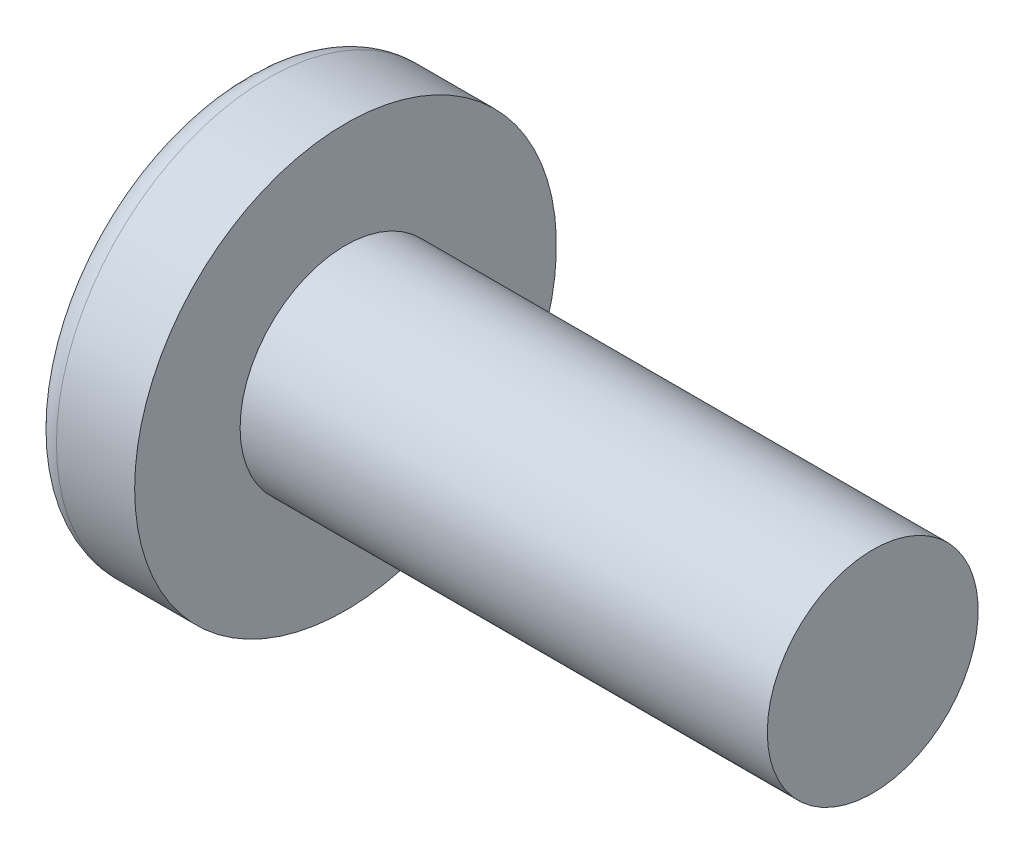
ISO-10303-21;
HEADER;
FILE_DESCRIPTION(('STEP AP214'),'2;1');
FILE_NAME('part.step','',(''),(''),'','','');
FILE_SCHEMA(('AUTOMOTIVE_DESIGN { 1 0 10303 214 1 1 1 1 }'));
ENDSEC;
DATA;
#1=APPLICATION_CONTEXT('core data for automotive mechanical design processes');
#2=APPLICATION_PROTOCOL_DEFINITION('international standard','automotive_design',2000,#1);
#3=PRODUCT_CONTEXT('',#1,'mechanical');
#4=PRODUCT('Part','Part','',(#3));
#5=PRODUCT_RELATED_PRODUCT_CATEGORY('part','',(#4));
#6=PRODUCT_DEFINITION_FORMATION('','',#4);
#7=PRODUCT_DEFINITION_CONTEXT('part definition',#1,'design');
#8=PRODUCT_DEFINITION('design','',#6,#7);
#9=PRODUCT_DEFINITION_SHAPE('','',#8);
#10=(LENGTH_UNIT() NAMED_UNIT(*) SI_UNIT(.MILLI.,.METRE.));
#11=(NAMED_UNIT(*) PLANE_ANGLE_UNIT() SI_UNIT($,.RADIAN.));
#12=(NAMED_UNIT(*) SI_UNIT($,.STERADIAN.) SOLID_ANGLE_UNIT());
#13=UNCERTAINTY_MEASURE_WITH_UNIT(LENGTH_MEASURE(1.E-05),#10,'distance_accuracy_value','');
#14=(GEOMETRIC_REPRESENTATION_CONTEXT(3) GLOBAL_UNCERTAINTY_ASSIGNED_CONTEXT((#13)) GLOBAL_UNIT_ASSIGNED_CONTEXT((#10,
#11,#12)) REPRESENTATION_CONTEXT('',''));
#15=CARTESIAN_POINT('',(0.,0.,0.));
#16=DIRECTION('',(0.,0.,1.));
#17=DIRECTION('',(1.,0.,0.));
#18=AXIS2_PLACEMENT_3D('',#15,#16,#17);
#19=CARTESIAN_POINT('',(6.5,0.,0.));
#20=DIRECTION('',(-1.,0.,0.));
#21=DIRECTION('',(0.,1.,0.));
#22=AXIS2_PLACEMENT_3D('',#19,#20,#21);
#23=SPHERICAL_SURFACE('',#22,6.5);
#24=CARTESIAN_POINT('',(1.22696010591455,0.,0.));
#25=DIRECTION('',(-1.,0.,0.));
#26=DIRECTION('',(0.,0.,1.));
#27=AXIS2_PLACEMENT_3D('',#24,#25,#26);
#28=CIRCLE('',#27,3.80066445182724);
#29=CARTESIAN_POINT('',(1.22696010591455,0.,3.80066445182724));
#30=VERTEX_POINT('',#29);
#31=EDGE_CURVE('E158',#30,#30,#28,.T.);
#32=ORIENTED_EDGE('',*,*,#31,.T.);
#33=EDGE_LOOP('',(#32));
#34=FACE_BOUND('',#33,.T.);
#35=CARTESIAN_POINT('',(6.48571960757402,-0.15048155459631,0.));
#36=DIRECTION('',(-0.0944735162161081,-0.995527375180494,0.));
#37=DIRECTION('',(0.995527375180495,-0.0944735162161082,0.));
#38=AXIS2_PLACEMENT_3D('',#35,#36,#37);
#39=CIRCLE('',#38,6.49824217555166);
#40=CARTESIAN_POINT('',(0.314004666074214,0.4352015980154,1.94783502836694));
#41=VERTEX_POINT('',#40);
#42=CARTESIAN_POINT('',(0.0329034112486453,0.461877533422321,0.461877533422322));
#43=VERTEX_POINT('',#42);
#44=EDGE_CURVE('E133',#41,#43,#39,.T.);
#45=ORIENTED_EDGE('',*,*,#44,.F.);
#46=CARTESIAN_POINT('',(5.02565375064329,0.,-1.83590765485334));
#47=DIRECTION('',(0.626149356629993,0.,0.779703137861998));
#48=DIRECTION('',(0.779703137861998,0.,-0.626149356629993));
#49=AXIS2_PLACEMENT_3D('',#46,#47,#48);
#50=CIRCLE('',#49,6.05852673674539);
#51=CARTESIAN_POINT('',(0.314004666074213,-0.435201598015413,1.94783502836693));
#52=VERTEX_POINT('',#51);
#53=EDGE_CURVE('E126',#41,#52,#50,.T.);
#54=ORIENTED_EDGE('',*,*,#53,.T.);
#55=CARTESIAN_POINT('',(6.48571960757402,0.150481554596309,0.));
#56=DIRECTION('',(-0.0944735162161078,0.995527375180494,0.));
#57=DIRECTION('',(-0.995527375180495,-0.0944735162161079,0.));
#58=AXIS2_PLACEMENT_3D('',#55,#56,#57);
#59=CIRCLE('',#58,6.49824217555166);
#60=CARTESIAN_POINT('',(0.0329034112486444,-0.461877533422324,0.461877533422322));
#61=VERTEX_POINT('',#60);
#62=EDGE_CURVE('E199',#61,#52,#59,.T.);
#63=ORIENTED_EDGE('',*,*,#62,.F.);
#64=CARTESIAN_POINT('',(6.48571960757402,0.,-0.150481554596309));
#65=DIRECTION('',(-0.0944735162161078,0.,-0.995527375180494));
#66=DIRECTION('',(-0.995527375180495,0.,0.0944735162161079));
#67=AXIS2_PLACEMENT_3D('',#64,#65,#66);
#68=CIRCLE('',#67,6.49824217555166);
#69=CARTESIAN_POINT('',(0.314004666074211,-1.94783502836694,0.435201598015406));
#70=VERTEX_POINT('',#69);
#71=EDGE_CURVE('E174',#70,#61,#68,.T.);
#72=ORIENTED_EDGE('',*,*,#71,.F.);
#73=CARTESIAN_POINT('',(5.02565375064329,1.83590765485333,0.));
#74=DIRECTION('',(0.626149356629993,-0.779703137861998,0.));
#75=DIRECTION('',(0.779703137861998,0.626149356629993,0.));
#76=AXIS2_PLACEMENT_3D('',#73,#74,#75);
#77=CIRCLE('',#76,6.05852673674539);
#78=CARTESIAN_POINT('',(0.314004666074211,-1.94783502836694,-0.435201598015407));
#79=VERTEX_POINT('',#78);
#80=EDGE_CURVE('E170',#70,#79,#77,.T.);
#81=ORIENTED_EDGE('',*,*,#80,.T.);
#82=CARTESIAN_POINT('',(6.48571960757402,0.,0.15048155459631));
#83=DIRECTION('',(-0.0944735162161081,0.,0.995527375180494));
#84=DIRECTION('',(0.995527375180495,0.,0.0944735162161082));
#85=AXIS2_PLACEMENT_3D('',#82,#83,#84);
#86=CIRCLE('',#85,6.49824217555166);
#87=CARTESIAN_POINT('',(0.0329034112486453,-0.46187753342232,-0.461877533422323));
#88=VERTEX_POINT('',#87);
#89=EDGE_CURVE('E54',#88,#79,#86,.T.);
#90=ORIENTED_EDGE('',*,*,#89,.F.);
#91=CARTESIAN_POINT('',(0.314004666074212,-0.435201598015399,-1.94783502836694));
#92=VERTEX_POINT('',#91);
#93=EDGE_CURVE('E196',#92,#88,#59,.T.);
#94=ORIENTED_EDGE('',*,*,#93,.F.);
#95=CARTESIAN_POINT('',(5.02565375064329,0.,1.83590765485334));
#96=DIRECTION('',(0.626149356629993,0.,-0.779703137861998));
#97=DIRECTION('',(-0.779703137861998,0.,-0.626149356629993));
#98=AXIS2_PLACEMENT_3D('',#95,#96,#97);
#99=CIRCLE('',#98,6.05852673674539);
#100=CARTESIAN_POINT('',(0.314004666074213,0.435201598015413,-1.94783502836693));
#101=VERTEX_POINT('',#100);
#102=EDGE_CURVE('E189',#92,#101,#99,.T.);
#103=ORIENTED_EDGE('',*,*,#102,.T.);
#104=CARTESIAN_POINT('',(0.0329034112486453,0.461877533422324,-0.461877533422323));
#105=VERTEX_POINT('',#104);
#106=EDGE_CURVE('E111',#105,#101,#39,.T.);
#107=ORIENTED_EDGE('',*,*,#106,.F.);
#108=CARTESIAN_POINT('',(0.314004666074214,1.94783502836693,-0.435201598015406));
#109=VERTEX_POINT('',#108);
#110=EDGE_CURVE('E47',#109,#105,#86,.T.);
#111=ORIENTED_EDGE('',*,*,#110,.F.);
#112=CARTESIAN_POINT('',(5.02565375064329,-1.83590765485334,0.));
#113=DIRECTION('',(0.626149356629993,0.779703137861998,0.));
#114=DIRECTION('',(-0.779703137861998,0.626149356629993,0.));
#115=AXIS2_PLACEMENT_3D('',#112,#113,#114);
#116=CIRCLE('',#115,6.05852673674539);
#117=CARTESIAN_POINT('',(0.314004666074214,1.94783502836693,0.435201598015406));
#118=VERTEX_POINT('',#117);
#119=EDGE_CURVE('E11',#109,#118,#116,.T.);
#120=ORIENTED_EDGE('',*,*,#119,.T.);
#121=EDGE_CURVE('E173',#43,#118,#68,.T.);
#122=ORIENTED_EDGE('',*,*,#121,.F.);
#123=EDGE_LOOP('',(#45,#54,#63,#72,#81,#90,#94,#103,#107,#111,#120,#122));
#124=FACE_BOUND('',#123,.T.);
#125=ADVANCED_FACE('F39',(#34,#124),#23,.T.);
#126=CARTESIAN_POINT('',(2.73951715374841,0.,-0.20502541296061));
#127=DIRECTION('',(-0.0944735162161081,0.,0.995527375180494));
#128=DIRECTION('',(0.995527375180495,0.,0.0944735162161082));
#129=AXIS2_PLACEMENT_3D('',#126,#127,#128);
#130=PLANE('',#129);
#131=ORIENTED_EDGE('',*,*,#110,.T.);
#132=DIRECTION('',(0.991114231601325,-0.0940547178968607,0.0940547178968604));
#133=VECTOR('',#132,1.);
#134=CARTESIAN_POINT('',(2.75862941145706,0.203211698708667,-0.203211698708667));
#135=LINE('',#134,#133);
#136=CARTESIAN_POINT('',(2.45,0.232500000000001,-0.232499999999999));
#137=VERTEX_POINT('',#136);
#138=EDGE_CURVE('E109',#105,#137,#135,.T.);
#139=ORIENTED_EDGE('',*,*,#138,.T.);
#140=DIRECTION('',(0.777577482844895,-0.624442325509115,0.0737905162291584));
#141=VECTOR('',#140,1.);
#142=CARTESIAN_POINT('',(0.,2.2,-0.465));
#143=LINE('',#142,#141);
#144=EDGE_CURVE('E131',#109,#137,#143,.T.);
#145=ORIENTED_EDGE('',*,*,#144,.F.);
#146=EDGE_LOOP('',(#131,#139,#145));
#147=FACE_BOUND('',#146,.T.);
#148=ADVANCED_FACE('F130',(#147),#130,.T.);
#149=DIRECTION('',(0.777577482844895,0.624442325509115,0.0737905162291584));
#150=VECTOR('',#149,1.);
#151=CARTESIAN_POINT('',(0.,-2.2,-0.465));
#152=LINE('',#151,#150);
#153=CARTESIAN_POINT('',(2.45,-0.2325,-0.2325));
#154=VERTEX_POINT('',#153);
#155=EDGE_CURVE('E152',#79,#154,#152,.T.);
#156=ORIENTED_EDGE('',*,*,#155,.T.);
#157=DIRECTION('',(-0.991114231601325,-0.0940547178968598,-0.0940547178968604));
#158=VECTOR('',#157,1.);
#159=CARTESIAN_POINT('',(2.75862941145706,-0.203211698708666,-0.203211698708667));
#160=LINE('',#159,#158);
#161=EDGE_CURVE('E197',#154,#88,#160,.T.);
#162=ORIENTED_EDGE('',*,*,#161,.T.);
#163=ORIENTED_EDGE('',*,*,#89,.T.);
#164=EDGE_LOOP('',(#156,#162,#163));
#165=FACE_BOUND('',#164,.T.);
#166=ADVANCED_FACE('F230',(#165),#130,.T.);
#167=CARTESIAN_POINT('',(2.73951715374841,0.,0.20502541296061));
#168=DIRECTION('',(-0.0944735162161078,0.,-0.995527375180494));
#169=DIRECTION('',(-0.995527375180495,0.,0.0944735162161079));
#170=AXIS2_PLACEMENT_3D('',#167,#168,#169);
#171=PLANE('',#170);
#172=DIRECTION('',(0.777577482844895,-0.624442325509115,-0.0737905162291583));
#173=VECTOR('',#172,1.);
#174=CARTESIAN_POINT('',(0.,2.2,0.465));
#175=LINE('',#174,#173);
#176=CARTESIAN_POINT('',(2.45,0.2325,0.2325));
#177=VERTEX_POINT('',#176);
#178=EDGE_CURVE('E138',#118,#177,#175,.T.);
#179=ORIENTED_EDGE('',*,*,#178,.T.);
#180=DIRECTION('',(-0.991114231601325,0.0940547178968601,0.0940547178968601));
#181=VECTOR('',#180,1.);
#182=CARTESIAN_POINT('',(2.75862941145706,0.203211698708666,0.203211698708667));
#183=LINE('',#182,#181);
#184=EDGE_CURVE('E185',#177,#43,#183,.T.);
#185=ORIENTED_EDGE('',*,*,#184,.T.);
#186=ORIENTED_EDGE('',*,*,#121,.T.);
#187=EDGE_LOOP('',(#179,#185,#186));
#188=FACE_BOUND('',#187,.T.);
#189=ADVANCED_FACE('F183',(#188),#171,.T.);
#190=ORIENTED_EDGE('',*,*,#71,.T.);
#191=DIRECTION('',(0.991114231601325,0.0940547178968604,-0.0940547178968601));
#192=VECTOR('',#191,1.);
#193=CARTESIAN_POINT('',(2.75862941145706,-0.203211698708668,0.203211698708667));
#194=LINE('',#193,#192);
#195=CARTESIAN_POINT('',(2.45,-0.232500000000001,0.232499999999999));
#196=VERTEX_POINT('',#195);
#197=EDGE_CURVE('E202',#61,#196,#194,.T.);
#198=ORIENTED_EDGE('',*,*,#197,.T.);
#199=DIRECTION('',(0.777577482844895,0.624442325509115,-0.0737905162291581));
#200=VECTOR('',#199,1.);
#201=CARTESIAN_POINT('',(0.,-2.2,0.464999999999999));
#202=LINE('',#201,#200);
#203=EDGE_CURVE('E149',#70,#196,#202,.T.);
#204=ORIENTED_EDGE('',*,*,#203,.F.);
#205=EDGE_LOOP('',(#190,#198,#204));
#206=FACE_BOUND('',#205,.T.);
#207=ADVANCED_FACE('F249',(#206),#171,.T.);
#208=CARTESIAN_POINT('',(-25.4,0.,0.));
#209=DIRECTION('',(-1.,0.,0.));
#210=DIRECTION('',(0.,0.,1.));
#211=AXIS2_PLACEMENT_3D('',#208,#209,#210);
#212=CYLINDRICAL_SURFACE('',#211,2.);
#213=CARTESIAN_POINT('',(13.1,0.,0.));
#214=DIRECTION('',(-1.,0.,0.));
#215=DIRECTION('',(0.,0.,1.));
#216=AXIS2_PLACEMENT_3D('',#213,#214,#215);
#217=CIRCLE('',#216,2.);
#218=CARTESIAN_POINT('',(13.1,0.,2.));
#219=VERTEX_POINT('',#218);
#220=EDGE_CURVE('E137',#219,#219,#217,.T.);
#221=ORIENTED_EDGE('',*,*,#220,.T.);
#222=EDGE_LOOP('',(#221));
#223=FACE_BOUND('',#222,.T.);
#224=CARTESIAN_POINT('',(3.1,0.,0.));
#225=DIRECTION('',(-1.,0.,0.));
#226=DIRECTION('',(0.,0.,1.));
#227=AXIS2_PLACEMENT_3D('',#224,#225,#226);
#228=CIRCLE('',#227,2.);
#229=CARTESIAN_POINT('',(3.1,0.,2.));
#230=VERTEX_POINT('',#229);
#231=EDGE_CURVE('E167',#230,#230,#228,.T.);
#232=ORIENTED_EDGE('',*,*,#231,.F.);
#233=EDGE_LOOP('',(#232));
#234=FACE_BOUND('',#233,.T.);
#235=ADVANCED_FACE('F41',(#223,#234),#212,.T.);
#236=CARTESIAN_POINT('',(3.1,2.,0.));
#237=DIRECTION('',(-1.,0.,0.));
#238=DIRECTION('',(0.,0.,1.));
#239=AXIS2_PLACEMENT_3D('',#236,#237,#238);
#240=PLANE('',#239);
#241=CARTESIAN_POINT('',(3.1,0.,0.));
#242=DIRECTION('',(-1.,0.,0.));
#243=DIRECTION('',(0.,0.,1.));
#244=AXIS2_PLACEMENT_3D('',#241,#242,#243);
#245=CIRCLE('',#244,4.);
#246=CARTESIAN_POINT('',(3.1,0.,4.));
#247=VERTEX_POINT('',#246);
#248=EDGE_CURVE('E164',#247,#247,#245,.T.);
#249=ORIENTED_EDGE('',*,*,#248,.F.);
#250=EDGE_LOOP('',(#249));
#251=FACE_BOUND('',#250,.T.);
#252=ORIENTED_EDGE('',*,*,#231,.T.);
#253=EDGE_LOOP('',(#252));
#254=FACE_BOUND('',#253,.T.);
#255=ADVANCED_FACE('F242',(#251,#254),#240,.F.);
#256=CARTESIAN_POINT('',(-25.4,0.,0.));
#257=DIRECTION('',(-1.,0.,0.));
#258=DIRECTION('',(0.,0.,1.));
#259=AXIS2_PLACEMENT_3D('',#256,#257,#258);
#260=CYLINDRICAL_SURFACE('',#259,4.);
#261=ORIENTED_EDGE('',*,*,#248,.T.);
#262=EDGE_LOOP('',(#261));
#263=FACE_BOUND('',#262,.T.);
#264=CARTESIAN_POINT('',(1.61635382117009,0.,0.));
#265=DIRECTION('',(-1.,0.,0.));
#266=DIRECTION('',(0.,0.,1.));
#267=AXIS2_PLACEMENT_3D('',#264,#265,#266);
#268=CIRCLE('',#267,4.);
#269=CARTESIAN_POINT('',(1.61635382117009,0.,4.));
#270=VERTEX_POINT('',#269);
#271=EDGE_CURVE('E161',#270,#270,#268,.T.);
#272=ORIENTED_EDGE('',*,*,#271,.F.);
#273=EDGE_LOOP('',(#272));
#274=FACE_BOUND('',#273,.T.);
#275=ADVANCED_FACE('F239',(#263,#274),#260,.T.);
#276=CARTESIAN_POINT('',(1.61635382117009,0.,0.));
#277=DIRECTION('',(-1.,0.,0.));
#278=DIRECTION('',(0.,0.,1.));
#279=AXIS2_PLACEMENT_3D('',#276,#277,#278);
#280=TOROIDAL_SURFACE('',#279,3.52,0.479999999999999);
#281=ORIENTED_EDGE('',*,*,#271,.T.);
#282=EDGE_LOOP('',(#281));
#283=FACE_BOUND('',#282,.T.);
#284=ORIENTED_EDGE('',*,*,#31,.F.);
#285=EDGE_LOOP('',(#284));
#286=FACE_BOUND('',#285,.T.);
#287=ADVANCED_FACE('F236',(#283,#286),#280,.T.);
#288=CARTESIAN_POINT('',(13.1,2.,0.));
#289=DIRECTION('',(1.,0.,0.));
#290=DIRECTION('',(0.,0.,-1.));
#291=AXIS2_PLACEMENT_3D('',#288,#289,#290);
#292=PLANE('',#291);
#293=ORIENTED_EDGE('',*,*,#220,.F.);
#294=EDGE_LOOP('',(#293));
#295=FACE_BOUND('',#294,.T.);
#296=ADVANCED_FACE('F234',(#295),#292,.T.);
#297=CARTESIAN_POINT('',(0.,2.2,0.465));
#298=DIRECTION('',(0.626149356629993,0.779703137861998,0.));
#299=DIRECTION('',(-0.779703137861998,0.626149356629993,0.));
#300=AXIS2_PLACEMENT_3D('',#297,#298,#299);
#301=PLANE('',#300);
#302=ORIENTED_EDGE('',*,*,#144,.T.);
#303=DIRECTION('',(0.,0.,-1.));
#304=VECTOR('',#303,1.);
#305=CARTESIAN_POINT('',(2.45,0.2325,0.2325));
#306=LINE('',#305,#304);
#307=EDGE_CURVE('E125',#177,#137,#306,.T.);
#308=ORIENTED_EDGE('',*,*,#307,.F.);
#309=ORIENTED_EDGE('',*,*,#178,.F.);
#310=ORIENTED_EDGE('',*,*,#119,.F.);
#311=EDGE_LOOP('',(#302,#308,#309,#310));
#312=FACE_BOUND('',#311,.T.);
#313=ADVANCED_FACE('F136',(#312),#301,.F.);
#314=CARTESIAN_POINT('',(2.45,-0.2325,-0.2325));
#315=DIRECTION('',(0.626149356629993,-0.779703137861998,0.));
#316=DIRECTION('',(0.779703137861998,0.626149356629993,0.));
#317=AXIS2_PLACEMENT_3D('',#314,#315,#316);
#318=PLANE('',#317);
#319=ORIENTED_EDGE('',*,*,#203,.T.);
#320=DIRECTION('',(0.,0.,1.));
#321=VECTOR('',#320,1.);
#322=CARTESIAN_POINT('',(2.45,-0.2325,-0.2325));
#323=LINE('',#322,#321);
#324=EDGE_CURVE('E145',#154,#196,#323,.T.);
#325=ORIENTED_EDGE('',*,*,#324,.F.);
#326=ORIENTED_EDGE('',*,*,#155,.F.);
#327=ORIENTED_EDGE('',*,*,#80,.F.);
#328=EDGE_LOOP('',(#319,#325,#326,#327));
#329=FACE_BOUND('',#328,.T.);
#330=ADVANCED_FACE('F269',(#329),#318,.F.);
#331=CARTESIAN_POINT('',(2.45,-0.2325,-0.2325));
#332=DIRECTION('',(1.,0.,0.));
#333=DIRECTION('',(0.,0.,-1.));
#334=AXIS2_PLACEMENT_3D('',#331,#332,#333);
#335=PLANE('',#334);
#336=DIRECTION('',(0.,1.,0.));
#337=VECTOR('',#336,1.);
#338=CARTESIAN_POINT('',(2.45,-0.2325,-0.2325));
#339=LINE('',#338,#337);
#340=EDGE_CURVE('E118',#154,#137,#339,.T.);
#341=ORIENTED_EDGE('',*,*,#340,.F.);
#342=ORIENTED_EDGE('',*,*,#324,.T.);
#343=DIRECTION('',(0.,-1.,0.));
#344=VECTOR('',#343,1.);
#345=CARTESIAN_POINT('',(2.45,0.2325,0.2325));
#346=LINE('',#345,#344);
#347=EDGE_CURVE('E143',#177,#196,#346,.T.);
#348=ORIENTED_EDGE('',*,*,#347,.F.);
#349=ORIENTED_EDGE('',*,*,#307,.T.);
#350=EDGE_LOOP('',(#341,#342,#348,#349));
#351=FACE_BOUND('',#350,.T.);
#352=ADVANCED_FACE('F141',(#351),#335,.F.);
#353=CARTESIAN_POINT('',(2.45,0.232500000000001,-0.232499999999999));
#354=DIRECTION('',(0.626149356629993,0.,-0.779703137861998));
#355=DIRECTION('',(0.779703137861998,0.,0.626149356629993));
#356=AXIS2_PLACEMENT_3D('',#353,#354,#355);
#357=PLANE('',#356);
#358=DIRECTION('',(0.777577482844895,0.0737905162291559,0.624442325509115));
#359=VECTOR('',#358,1.);
#360=CARTESIAN_POINT('',(0.,-0.464999999999991,-2.2));
#361=LINE('',#360,#359);
#362=EDGE_CURVE('E115',#92,#154,#361,.T.);
#363=ORIENTED_EDGE('',*,*,#362,.T.);
#364=ORIENTED_EDGE('',*,*,#340,.T.);
#365=DIRECTION('',(0.777577482844895,-0.0737905162291606,0.624442325509115));
#366=VECTOR('',#365,1.);
#367=CARTESIAN_POINT('',(0.,0.465000000000008,-2.2));
#368=LINE('',#367,#366);
#369=EDGE_CURVE('E105',#101,#137,#368,.T.);
#370=ORIENTED_EDGE('',*,*,#369,.F.);
#371=ORIENTED_EDGE('',*,*,#102,.F.);
#372=EDGE_LOOP('',(#363,#364,#370,#371));
#373=FACE_BOUND('',#372,.T.);
#374=ADVANCED_FACE('F119',(#373),#357,.F.);
#375=CARTESIAN_POINT('',(2.73951715374841,-0.20502541296061,0.));
#376=DIRECTION('',(-0.0944735162161078,0.995527375180494,0.));
#377=DIRECTION('',(-0.995527375180495,-0.0944735162161079,0.));
#378=AXIS2_PLACEMENT_3D('',#375,#376,#377);
#379=PLANE('',#378);
#380=ORIENTED_EDGE('',*,*,#93,.T.);
#381=ORIENTED_EDGE('',*,*,#161,.F.);
#382=ORIENTED_EDGE('',*,*,#362,.F.);
#383=EDGE_LOOP('',(#380,#381,#382));
#384=FACE_BOUND('',#383,.T.);
#385=ADVANCED_FACE('F221',(#384),#379,.T.);
#386=CARTESIAN_POINT('',(2.73951715374841,0.20502541296061,0.));
#387=DIRECTION('',(-0.0944735162161081,-0.995527375180494,0.));
#388=DIRECTION('',(0.995527375180495,-0.0944735162161082,0.));
#389=AXIS2_PLACEMENT_3D('',#386,#387,#388);
#390=PLANE('',#389);
#391=ORIENTED_EDGE('',*,*,#106,.T.);
#392=ORIENTED_EDGE('',*,*,#369,.T.);
#393=ORIENTED_EDGE('',*,*,#138,.F.);
#394=EDGE_LOOP('',(#391,#392,#393));
#395=FACE_BOUND('',#394,.T.);
#396=ADVANCED_FACE('F107',(#395),#390,.T.);
#397=CARTESIAN_POINT('',(0.,-0.465000000000007,2.2));
#398=DIRECTION('',(0.626149356629993,0.,0.779703137861998));
#399=DIRECTION('',(-0.779703137861998,0.,0.626149356629993));
#400=AXIS2_PLACEMENT_3D('',#397,#398,#399);
#401=PLANE('',#400);
#402=DIRECTION('',(0.777577482844895,-0.0737905162291562,-0.624442325509115));
#403=VECTOR('',#402,1.);
#404=CARTESIAN_POINT('',(0.,0.464999999999992,2.2));
#405=LINE('',#404,#403);
#406=EDGE_CURVE('E205',#41,#177,#405,.T.);
#407=ORIENTED_EDGE('',*,*,#406,.T.);
#408=ORIENTED_EDGE('',*,*,#347,.T.);
#409=DIRECTION('',(0.777577482844895,0.0737905162291604,-0.624442325509115));
#410=VECTOR('',#409,1.);
#411=CARTESIAN_POINT('',(0.,-0.465000000000007,2.2));
#412=LINE('',#411,#410);
#413=EDGE_CURVE('E114',#52,#196,#412,.T.);
#414=ORIENTED_EDGE('',*,*,#413,.F.);
#415=ORIENTED_EDGE('',*,*,#53,.F.);
#416=EDGE_LOOP('',(#407,#408,#414,#415));
#417=FACE_BOUND('',#416,.T.);
#418=ADVANCED_FACE('F209',(#417),#401,.F.);
#419=ORIENTED_EDGE('',*,*,#44,.T.);
#420=ORIENTED_EDGE('',*,*,#184,.F.);
#421=ORIENTED_EDGE('',*,*,#406,.F.);
#422=EDGE_LOOP('',(#419,#420,#421));
#423=FACE_BOUND('',#422,.T.);
#424=ADVANCED_FACE('F211',(#423),#390,.T.);
#425=ORIENTED_EDGE('',*,*,#62,.T.);
#426=ORIENTED_EDGE('',*,*,#413,.T.);
#427=ORIENTED_EDGE('',*,*,#197,.F.);
#428=EDGE_LOOP('',(#425,#426,#427));
#429=FACE_BOUND('',#428,.T.);
#430=ADVANCED_FACE('F213',(#429),#379,.T.);
#431=CLOSED_SHELL('',(#125,#148,#166,#189,#207,#235,#255,#275,#287,#296,#313,#330,#352,#374,
#385,#396,#418,#424,#430));
#432=MANIFOLD_SOLID_BREP('B2',#431);
#433=ADVANCED_BREP_SHAPE_REPRESENTATION('',(#18,#432),#14);
#434=SHAPE_DEFINITION_REPRESENTATION(#9,#433);
ENDSEC;
END-ISO-10303-21;
